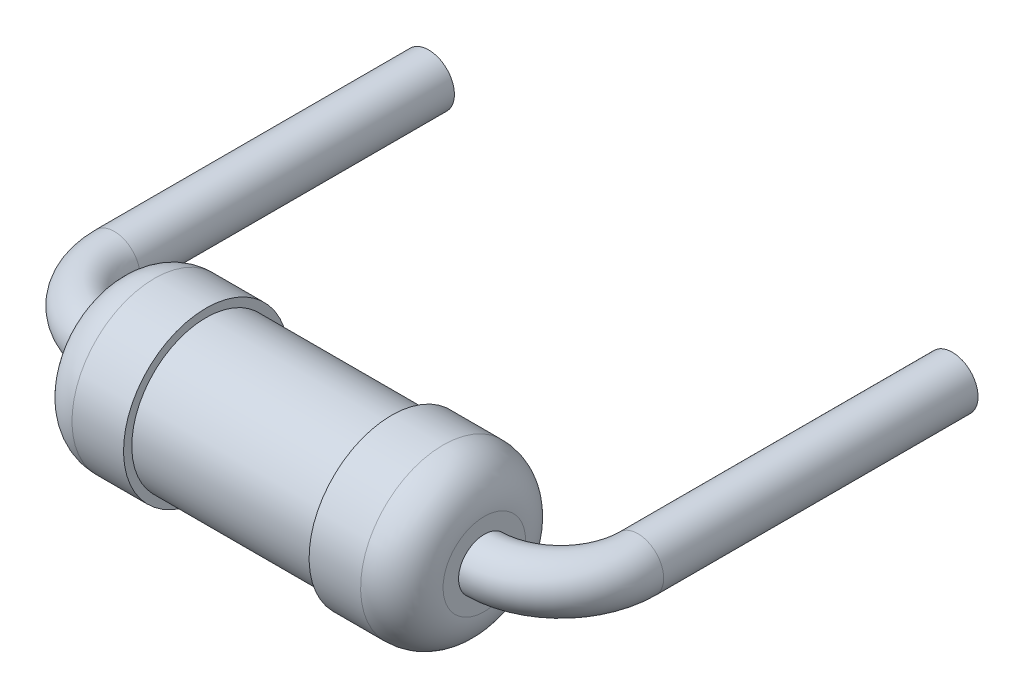
ISO-10303-21;
HEADER;
FILE_DESCRIPTION(('STEP AP214'),'2;1');
FILE_NAME('part.step','',(''),(''),'','','');
FILE_SCHEMA(('AUTOMOTIVE_DESIGN { 1 0 10303 214 1 1 1 1 }'));
ENDSEC;
DATA;
#1=APPLICATION_CONTEXT('core data for automotive mechanical design processes');
#2=APPLICATION_PROTOCOL_DEFINITION('international standard','automotive_design',2000,#1);
#3=PRODUCT_CONTEXT('',#1,'mechanical');
#4=PRODUCT('Part','Part','',(#3));
#5=PRODUCT_RELATED_PRODUCT_CATEGORY('part','',(#4));
#6=PRODUCT_DEFINITION_FORMATION('','',#4);
#7=PRODUCT_DEFINITION_CONTEXT('part definition',#1,'design');
#8=PRODUCT_DEFINITION('design','',#6,#7);
#9=PRODUCT_DEFINITION_SHAPE('','',#8);
#10=(LENGTH_UNIT() NAMED_UNIT(*) SI_UNIT(.MILLI.,.METRE.));
#11=(NAMED_UNIT(*) PLANE_ANGLE_UNIT() SI_UNIT($,.RADIAN.));
#12=(NAMED_UNIT(*) SI_UNIT($,.STERADIAN.) SOLID_ANGLE_UNIT());
#13=UNCERTAINTY_MEASURE_WITH_UNIT(LENGTH_MEASURE(1.E-05),#10,'distance_accuracy_value','');
#14=(GEOMETRIC_REPRESENTATION_CONTEXT(3) GLOBAL_UNCERTAINTY_ASSIGNED_CONTEXT((#13)) GLOBAL_UNIT_ASSIGNED_CONTEXT((#10,
#11,#12)) REPRESENTATION_CONTEXT('',''));
#15=CARTESIAN_POINT('',(0.,0.,0.));
#16=DIRECTION('',(0.,0.,1.));
#17=DIRECTION('',(1.,0.,0.));
#18=AXIS2_PLACEMENT_3D('',#15,#16,#17);
#19=CARTESIAN_POINT('',(4.83,0.,-3.));
#20=DIRECTION('',(0.,0.,1.));
#21=DIRECTION('',(1.,0.,0.));
#22=AXIS2_PLACEMENT_3D('',#19,#20,#21);
#23=PLANE('',#22);
#24=CARTESIAN_POINT('',(5.08,0.,-3.));
#25=DIRECTION('',(0.,0.,-1.));
#26=DIRECTION('',(-1.,0.,0.));
#27=AXIS2_PLACEMENT_3D('',#24,#25,#26);
#28=CIRCLE('',#27,0.25);
#29=CARTESIAN_POINT('',(4.83,0.,-3.));
#30=VERTEX_POINT('',#29);
#31=EDGE_CURVE('E11',#30,#30,#28,.T.);
#32=ORIENTED_EDGE('',*,*,#31,.T.);
#33=EDGE_LOOP('',(#32));
#34=FACE_BOUND('',#33,.T.);
#35=ADVANCED_FACE('F17',(#34),#23,.F.);
#36=CARTESIAN_POINT('',(5.08,0.,0.05));
#37=DIRECTION('',(0.,0.,-1.));
#38=DIRECTION('',(-1.,0.,0.));
#39=AXIS2_PLACEMENT_3D('',#36,#37,#38);
#40=CYLINDRICAL_SURFACE('',#39,0.25);
#41=DIRECTION('',(0.,0.,-1.));
#42=VECTOR('',#41,1.);
#43=CARTESIAN_POINT('',(4.83,0.,0.05));
#44=LINE('',#43,#42);
#45=CARTESIAN_POINT('',(4.83,0.,0.05));
#46=VERTEX_POINT('',#45);
#47=EDGE_CURVE('E25',#46,#30,#44,.T.);
#48=ORIENTED_EDGE('',*,*,#47,.T.);
#49=ORIENTED_EDGE('',*,*,#31,.F.);
#50=ORIENTED_EDGE('',*,*,#47,.F.);
#51=CARTESIAN_POINT('',(5.08,0.,0.05));
#52=DIRECTION('',(0.,0.,1.));
#53=DIRECTION('',(1.,0.,0.));
#54=AXIS2_PLACEMENT_3D('',#51,#52,#53);
#55=CIRCLE('',#54,0.25);
#56=EDGE_CURVE('E144',#46,#46,#55,.T.);
#57=ORIENTED_EDGE('',*,*,#56,.F.);
#58=EDGE_LOOP('',(#48,#49,#50,#57));
#59=FACE_BOUND('',#58,.T.);
#60=ADVANCED_FACE('F148',(#59),#40,.T.);
#61=CARTESIAN_POINT('',(4.33,0.,0.05));
#62=DIRECTION('',(0.,1.,0.));
#63=DIRECTION('',(0.,0.,1.));
#64=AXIS2_PLACEMENT_3D('',#61,#62,#63);
#65=TOROIDAL_SURFACE('',#64,0.75,0.25);
#66=CARTESIAN_POINT('',(4.34,0.,0.549899989998));
#67=CARTESIAN_POINT('',(4.34,-0.01164050410422,0.549899991162));
#68=CARTESIAN_POINT('',(4.34,-0.02328113700996,0.550622828944));
#69=CARTESIAN_POINT('',(4.34,-0.03485062492983,0.552068403169));
#70=CARTESIAN_POINT('',(4.34,-0.05786889927372,0.55640538608));
#71=CARTESIAN_POINT('',(4.34,-0.06931396793922,0.559316679184));
#72=CARTESIAN_POINT('',(4.34,-0.08054453861146,0.562940371124));
#73=CARTESIAN_POINT('',(4.34,-0.102472370435,0.571565542428));
#74=CARTESIAN_POINT('',(4.34,-0.113168471237,0.576570161904));
#75=CARTESIAN_POINT('',(4.34,-0.123520149554,0.582233698909));
#76=CARTESIAN_POINT('',(4.34,-0.143440927187,0.594813804343));
#77=CARTESIAN_POINT('',(4.34,-0.153008498876,0.601732848602));
#78=CARTESIAN_POINT('',(4.34,-0.162116805716,0.609236193325));
#79=CARTESIAN_POINT('',(4.34,-0.179326995951,0.625325812165));
#80=CARTESIAN_POINT('',(4.34,-0.187427805149,0.633913311284));
#81=CARTESIAN_POINT('',(4.34,-0.194970751604,0.642991732749));
#82=CARTESIAN_POINT('',(4.34,-0.208861923811,0.662021732419));
#83=CARTESIAN_POINT('',(4.34,-0.215210007466,0.671973515983));
#84=CARTESIAN_POINT('',(4.34,-0.220919853528,0.682306073073));
#85=CARTESIAN_POINT('',(4.34,-0.231000081052,0.703602963674));
#86=CARTESIAN_POINT('',(4.34,-0.235371260959,0.714567031657));
#87=CARTESIAN_POINT('',(4.34,-0.239044818889,0.725787734512));
#88=CARTESIAN_POINT('',(4.34,-0.244956633252,0.748597257437));
#89=CARTESIAN_POINT('',(4.34,-0.247196328539,0.760185820404));
#90=CARTESIAN_POINT('',(4.34,-0.248702721603,0.771896818599));
#91=CARTESIAN_POINT('',(4.34,-0.250236253198,0.795410784363));
#92=CARTESIAN_POINT('',(4.34,-0.250265081604,0.807213760322));
#93=CARTESIAN_POINT('',(4.34,-0.249550564145,0.818999739241));
#94=CARTESIAN_POINT('',(4.34,-0.246651196549,0.842384879388));
#95=CARTESIAN_POINT('',(4.34,-0.244467961817,0.853984364368));
#96=CARTESIAN_POINT('',(4.34,-0.241557769401,0.865427456673));
#97=CARTESIAN_POINT('',(4.34,-0.234328097063,0.887855103735));
#98=CARTESIAN_POINT('',(4.34,-0.230009957691,0.89884022225));
#99=CARTESIAN_POINT('',(4.34,-0.225007281178,0.909534878553));
#100=CARTESIAN_POINT('',(4.34,-0.213703414457,0.930210386901));
#101=CARTESIAN_POINT('',(4.34,-0.207403209753,0.940191922291));
#102=CARTESIAN_POINT('',(4.34,-0.200485423872,0.9497592585));
#103=CARTESIAN_POINT('',(4.34,-0.185507848737,0.9679501517));
#104=CARTESIAN_POINT('',(4.34,-0.177448695368,0.976574397374));
#105=CARTESIAN_POINT('',(4.34,-0.168861006149,0.984675563246));
#106=CARTESIAN_POINT('',(4.34,-0.150740352219,0.999737449451));
#107=CARTESIAN_POINT('',(4.34,-0.141207726994,1.006698777772));
#108=CARTESIAN_POINT('',(4.34,-0.131254458413,1.013046907821));
#109=CARTESIAN_POINT('',(4.34,-0.110632681236,1.024446271493));
#110=CARTESIAN_POINT('',(4.34,-0.09996428813031,1.029497977347));
#111=CARTESIAN_POINT('',(4.34,-0.08899810082804,1.033868315528));
#112=CARTESIAN_POINT('',(4.34,-0.06660573678443,1.041201389552));
#113=CARTESIAN_POINT('',(4.34,-0.05517952646699,1.044164431426));
#114=CARTESIAN_POINT('',(4.34,-0.04358893599727,1.046402273007));
#115=CARTESIAN_POINT('',(4.34,-0.02110235314309,1.049295690116));
#116=CARTESIAN_POINT('',(4.34,-0.01022004210752,1.050058171083));
#117=CARTESIAN_POINT('',(4.34,0.0006882613375073,1.050186160755));
#118=CARTESIAN_POINT('',(4.34,0.0233358865772,1.049137109091));
#119=CARTESIAN_POINT('',(4.34,0.03507031068188,1.04785246394));
#120=CARTESIAN_POINT('',(4.34,0.04670026038733,1.04583159902));
#121=CARTESIAN_POINT('',(4.34,0.06961621024999,1.040350011269));
#122=CARTESIAN_POINT('',(4.34,0.08090228630662,1.036889059544));
#123=CARTESIAN_POINT('',(4.34,0.09194735345427,1.032724648859));
#124=CARTESIAN_POINT('',(4.34,0.113430350588,1.023045880168));
#125=CARTESIAN_POINT('',(4.34,0.123868238698,1.017531119357));
#126=CARTESIAN_POINT('',(4.34,0.133937127535,1.011370767302));
#127=CARTESIAN_POINT('',(4.34,0.153226135103,0.99783763726));
#128=CARTESIAN_POINT('',(4.34,0.162446020713,0.990464305002));
#129=CARTESIAN_POINT('',(4.34,0.171182023116,0.982526335115));
#130=CARTESIAN_POINT('',(4.34,0.187593706196,0.965618198848));
#131=CARTESIAN_POINT('',(4.34,0.195268887616,0.956647370097));
#132=CARTESIAN_POINT('',(4.34,0.202362534275,0.947213093808));
#133=CARTESIAN_POINT('',(4.34,0.215315466445,0.927528883997));
#134=CARTESIAN_POINT('',(4.34,0.221173922232,0.917278252218));
#135=CARTESIAN_POINT('',(4.34,0.226373965152,0.906681994138));
#136=CARTESIAN_POINT('',(4.34,0.235409237469,0.884919036811));
#137=CARTESIAN_POINT('',(4.34,0.239243276281,0.873751706758));
#138=CARTESIAN_POINT('',(4.34,0.24236560706,0.862368932693));
#139=CARTESIAN_POINT('',(4.34,0.247163118276,0.839298280692));
#140=CARTESIAN_POINT('',(4.34,0.248836785479,0.827609961549));
#141=CARTESIAN_POINT('',(4.34,0.249770959641,0.815843924561));
#142=CARTESIAN_POINT('',(4.34,0.250160814947,0.792283062999));
#143=CARTESIAN_POINT('',(4.34,0.24961480538,0.780488090075));
#144=CARTESIAN_POINT('',(4.34,0.248327919554,0.768755472219));
#145=CARTESIAN_POINT('',(4.34,0.24429651896,0.745539328242));
#146=CARTESIAN_POINT('',(4.34,0.241550410048,0.734055962058));
#147=CARTESIAN_POINT('',(4.34,0.23808817101,0.722772047459));
#148=CARTESIAN_POINT('',(4.34,0.22977871686,0.700723294126));
#149=CARTESIAN_POINT('',(4.34,0.224930379057,0.689958764222));
#150=CARTESIAN_POINT('',(4.34,0.219415324052,0.679522729019));
#151=CARTESIAN_POINT('',(4.34,0.207122627566,0.659422435318));
#152=CARTESIAN_POINT('',(4.34,0.20034469825,0.649758245053));
#153=CARTESIAN_POINT('',(4.34,0.192971688189,0.640539169756));
#154=CARTESIAN_POINT('',(4.34,0.177131356967,0.623098938552));
#155=CARTESIAN_POINT('',(4.34,0.168664735605,0.614877058112));
#156=CARTESIAN_POINT('',(4.34,0.159694040411,0.607201210429));
#157=CARTESIAN_POINT('',(4.34,0.140866486823,0.593038035215));
#158=CARTESIAN_POINT('',(4.34,0.131011048519,0.586548760303));
#159=CARTESIAN_POINT('',(4.34,0.120759510971,0.580688498879));
#160=CARTESIAN_POINT('',(4.34,0.09960983218682,0.570303493605));
#161=CARTESIAN_POINT('',(4.34,0.08871311353879,0.56577575842));
#162=CARTESIAN_POINT('',(4.34,0.07754383250254,0.561940054475));
#163=CARTESIAN_POINT('',(4.34,0.05004266470253,0.554390331681));
#164=CARTESIAN_POINT('',(4.34,0.03350366980571,0.551397062442));
#165=CARTESIAN_POINT('',(4.34,0.01675151013628,0.549899991673));
#166=CARTESIAN_POINT('',(4.34,0.,0.549899989998));
#167=(BOUNDED_CURVE() B_SPLINE_CURVE(4,(#66,#67,#68,#69,#70,#71,#72,#73,#74,#75,#76,#77,#78,#79,
#80,#81,#82,#83,#84,#85,#86,#87,#88,#89,#90,#91,#92,#93,#94,#95,#96,#97,#98,#99,#100,#101,#102,
#103,#104,#105,#106,#107,#108,#109,#110,#111,#112,#113,#114,#115,#116,#117,#118,#119,#120,#121,
#122,#123,#124,#125,#126,#127,#128,#129,#130,#131,#132,#133,#134,#135,#136,#137,#138,#139,#140,
#141,#142,#143,#144,#145,#146,#147,#148,#149,#150,#151,#152,#153,#154,#155,#156,#157,#158,#159,
#160,#161,#162,#163,#164,#165,#166),.UNSPECIFIED.,.T.,.F.) B_SPLINE_CURVE_WITH_KNOTS((5,3,3,3,3,
3,3,3,3,3,3,3,3,3,3,3,3,3,3,3,3,3,3,3,3,3,3,3,3,3,3,3,3,5),(0.,0.02954854255526,
0.05950725143982,0.08953239653051,0.119615784102,0.149732114388,0.1798534838,0.209958258036,
0.240033799607,0.270075422819,0.300083939966,0.330063238238,0.360018474891,0.389954967342,
0.4198776386,0.449790835667,0.479698369962,0.507343389522,0.537249550404,0.567159850886,
0.597077915475,0.62700784525,0.656954319928,0.686922528179,0.716917796113,0.746944740378,
0.777005773224,0.807098913279,0.837215225316,0.867336923249,0.897438131975,0.927490895148,
0.957477675614,1.),
.UNSPECIFIED.) CURVE() GEOMETRIC_REPRESENTATION_ITEM() RATIONAL_B_SPLINE_CURVE((1.,1.,1.,1.,1.,
1.,1.,1.,1.,1.,1.,1.,1.,1.,1.,1.,1.,1.,1.,1.,1.,1.,1.,1.,1.,1.,1.,1.,1.,1.,1.,1.,1.,1.,1.,1.,1.,
1.,1.,1.,1.,1.,1.,1.,1.,1.,1.,1.,1.,1.,1.,1.,1.,1.,1.,1.,1.,1.,1.,1.,1.,1.,1.,1.,1.,1.,1.,1.,1.,
1.,1.,1.,1.,1.,1.,1.,1.,1.,1.,1.,1.,1.,1.,1.,1.,1.,1.,1.,1.,1.,1.,1.,1.,1.,1.,1.,1.,1.,1.,1.,1.)) REPRESENTATION_ITEM(''));
#168=CARTESIAN_POINT('',(4.34,0.,0.549899989998));
#169=VERTEX_POINT('',#168);
#170=EDGE_CURVE('E130',#169,#169,#167,.T.);
#171=ORIENTED_EDGE('',*,*,#170,.F.);
#172=CARTESIAN_POINT('',(4.33,0.,0.05));
#173=DIRECTION('',(0.,1.,0.));
#174=DIRECTION('',(0.,0.,1.));
#175=AXIS2_PLACEMENT_3D('',#172,#173,#174);
#176=CIRCLE('',#175,0.5);
#177=EDGE_CURVE('E136',#169,#46,#176,.T.);
#178=ORIENTED_EDGE('',*,*,#177,.T.);
#179=ORIENTED_EDGE('',*,*,#56,.T.);
#180=ORIENTED_EDGE('',*,*,#177,.F.);
#181=EDGE_LOOP('',(#171,#178,#179,#180));
#182=FACE_BOUND('',#181,.T.);
#183=ADVANCED_FACE('F151',(#182),#65,.T.);
#184=CARTESIAN_POINT('',(4.34,0.8,0.8));
#185=DIRECTION('',(-1.,0.,0.));
#186=DIRECTION('',(0.,0.,1.));
#187=AXIS2_PLACEMENT_3D('',#184,#185,#186);
#188=PLANE('',#187);
#189=ORIENTED_EDGE('',*,*,#170,.T.);
#190=EDGE_LOOP('',(#189));
#191=FACE_BOUND('',#190,.T.);
#192=CARTESIAN_POINT('',(4.34,0.,0.8));
#193=DIRECTION('',(1.,0.,0.));
#194=DIRECTION('',(0.,1.,0.));
#195=AXIS2_PLACEMENT_3D('',#192,#193,#194);
#196=CIRCLE('',#195,0.4);
#197=CARTESIAN_POINT('',(4.34,0.4,0.8));
#198=VERTEX_POINT('',#197);
#199=EDGE_CURVE('E137',#198,#198,#196,.T.);
#200=ORIENTED_EDGE('',*,*,#199,.T.);
#201=EDGE_LOOP('',(#200));
#202=FACE_BOUND('',#201,.T.);
#203=ADVANCED_FACE('F153',(#191,#202),#188,.F.);
#204=CARTESIAN_POINT('',(3.94,0.,0.8));
#205=DIRECTION('',(1.,0.,0.));
#206=DIRECTION('',(0.,1.,0.));
#207=AXIS2_PLACEMENT_3D('',#204,#205,#206);
#208=DEGENERATE_TOROIDAL_SURFACE('',#207,0.4,0.4,.T.);
#209=CARTESIAN_POINT('',(3.94,0.4,0.8));
#210=DIRECTION('',(0.,0.,-1.));
#211=DIRECTION('',(0.,1.,0.));
#212=AXIS2_PLACEMENT_3D('',#209,#210,#211);
#213=CIRCLE('',#212,0.4);
#214=CARTESIAN_POINT('',(3.94,0.8,0.8));
#215=VERTEX_POINT('',#214);
#216=EDGE_CURVE('E128',#215,#198,#213,.T.);
#217=ORIENTED_EDGE('',*,*,#216,.F.);
#218=CARTESIAN_POINT('',(3.94,0.,0.8));
#219=DIRECTION('',(1.,0.,0.));
#220=DIRECTION('',(0.,1.,0.));
#221=AXIS2_PLACEMENT_3D('',#218,#219,#220);
#222=CIRCLE('',#221,0.8);
#223=EDGE_CURVE('E124',#215,#215,#222,.T.);
#224=ORIENTED_EDGE('',*,*,#223,.T.);
#225=ORIENTED_EDGE('',*,*,#216,.T.);
#226=ORIENTED_EDGE('',*,*,#199,.F.);
#227=EDGE_LOOP('',(#217,#224,#225,#226));
#228=FACE_BOUND('',#227,.T.);
#229=ADVANCED_FACE('F156',(#228),#208,.T.);
#230=CARTESIAN_POINT('',(0.25,0.,-3.));
#231=DIRECTION('',(0.,0.,-1.));
#232=DIRECTION('',(0.,-1.,0.));
#233=AXIS2_PLACEMENT_3D('',#230,#231,#232);
#234=PLANE('',#233);
#235=CARTESIAN_POINT('',(0.,0.,-3.));
#236=DIRECTION('',(0.,0.,1.));
#237=DIRECTION('',(1.,0.,0.));
#238=AXIS2_PLACEMENT_3D('',#235,#236,#237);
#239=CIRCLE('',#238,0.25);
#240=CARTESIAN_POINT('',(0.25,0.,-3.));
#241=VERTEX_POINT('',#240);
#242=EDGE_CURVE('E99',#241,#241,#239,.T.);
#243=ORIENTED_EDGE('',*,*,#242,.F.);
#244=EDGE_LOOP('',(#243));
#245=FACE_BOUND('',#244,.T.);
#246=ADVANCED_FACE('F238',(#245),#234,.T.);
#247=CARTESIAN_POINT('',(3.44,0.,0.8));
#248=DIRECTION('',(-1.,0.,0.));
#249=DIRECTION('',(0.,1.,0.));
#250=AXIS2_PLACEMENT_3D('',#247,#248,#249);
#251=CYLINDRICAL_SURFACE('',#250,0.8);
#252=CARTESIAN_POINT('',(3.44,0.,0.8));
#253=DIRECTION('',(1.,0.,0.));
#254=DIRECTION('',(0.,1.,0.));
#255=AXIS2_PLACEMENT_3D('',#252,#253,#254);
#256=CIRCLE('',#255,0.8);
#257=CARTESIAN_POINT('',(3.44,0.8,0.8));
#258=VERTEX_POINT('',#257);
#259=EDGE_CURVE('E101',#258,#258,#256,.T.);
#260=ORIENTED_EDGE('',*,*,#259,.T.);
#261=DIRECTION('',(1.,0.,0.));
#262=VECTOR('',#261,1.);
#263=CARTESIAN_POINT('',(3.44,0.8,0.8));
#264=LINE('',#263,#262);
#265=EDGE_CURVE('E129',#258,#215,#264,.T.);
#266=ORIENTED_EDGE('',*,*,#265,.T.);
#267=ORIENTED_EDGE('',*,*,#223,.F.);
#268=ORIENTED_EDGE('',*,*,#265,.F.);
#269=EDGE_LOOP('',(#260,#266,#267,#268));
#270=FACE_BOUND('',#269,.T.);
#271=ADVANCED_FACE('F242',(#270),#251,.T.);
#272=CARTESIAN_POINT('',(0.,0.,-3.));
#273=DIRECTION('',(0.,0.,1.));
#274=DIRECTION('',(1.,0.,0.));
#275=AXIS2_PLACEMENT_3D('',#272,#273,#274);
#276=CYLINDRICAL_SURFACE('',#275,0.25);
#277=DIRECTION('',(0.,0.,1.));
#278=VECTOR('',#277,1.);
#279=CARTESIAN_POINT('',(0.25,0.,-3.));
#280=LINE('',#279,#278);
#281=CARTESIAN_POINT('',(0.25,0.,0.05));
#282=VERTEX_POINT('',#281);
#283=EDGE_CURVE('E93',#241,#282,#280,.T.);
#284=ORIENTED_EDGE('',*,*,#283,.T.);
#285=CARTESIAN_POINT('',(0.,0.,0.05));
#286=DIRECTION('',(0.,0.,1.));
#287=DIRECTION('',(1.,0.,0.));
#288=AXIS2_PLACEMENT_3D('',#285,#286,#287);
#289=CIRCLE('',#288,0.25);
#290=EDGE_CURVE('E97',#282,#282,#289,.T.);
#291=ORIENTED_EDGE('',*,*,#290,.F.);
#292=ORIENTED_EDGE('',*,*,#283,.F.);
#293=ORIENTED_EDGE('',*,*,#242,.T.);
#294=EDGE_LOOP('',(#284,#291,#292,#293));
#295=FACE_BOUND('',#294,.T.);
#296=ADVANCED_FACE('F95',(#295),#276,.T.);
#297=CARTESIAN_POINT('',(3.44,0.8,0.8));
#298=DIRECTION('',(-1.,0.,0.));
#299=DIRECTION('',(0.,0.,1.));
#300=AXIS2_PLACEMENT_3D('',#297,#298,#299);
#301=PLANE('',#300);
#302=CARTESIAN_POINT('',(3.44,0.,0.8));
#303=DIRECTION('',(-1.,0.,0.));
#304=DIRECTION('',(0.,1.,0.));
#305=AXIS2_PLACEMENT_3D('',#302,#303,#304);
#306=CIRCLE('',#305,0.72);
#307=CARTESIAN_POINT('',(3.44,0.72,0.8));
#308=VERTEX_POINT('',#307);
#309=EDGE_CURVE('E182',#308,#308,#306,.T.);
#310=ORIENTED_EDGE('',*,*,#309,.F.);
#311=EDGE_LOOP('',(#310));
#312=FACE_BOUND('',#311,.T.);
#313=ORIENTED_EDGE('',*,*,#259,.F.);
#314=EDGE_LOOP('',(#313));
#315=FACE_BOUND('',#314,.T.);
#316=ADVANCED_FACE('F241',(#312,#315),#301,.T.);
#317=CARTESIAN_POINT('',(0.75,0.,0.05));
#318=DIRECTION('',(0.,1.,0.));
#319=DIRECTION('',(-1.,0.,0.));
#320=AXIS2_PLACEMENT_3D('',#317,#318,#319);
#321=TOROIDAL_SURFACE('',#320,0.75,0.25);
#322=ORIENTED_EDGE('',*,*,#290,.T.);
#323=CARTESIAN_POINT('',(0.75,0.,0.05));
#324=DIRECTION('',(0.,1.,0.));
#325=DIRECTION('',(-1.,0.,0.));
#326=AXIS2_PLACEMENT_3D('',#323,#324,#325);
#327=CIRCLE('',#326,0.5);
#328=CARTESIAN_POINT('',(0.74,0.,0.549899989998));
#329=VERTEX_POINT('',#328);
#330=EDGE_CURVE('E105',#282,#329,#327,.T.);
#331=ORIENTED_EDGE('',*,*,#330,.T.);
#332=CARTESIAN_POINT('',(0.74,0.,0.549899989998));
#333=CARTESIAN_POINT('',(0.74,-0.01164050410382,0.549899991162));
#334=CARTESIAN_POINT('',(0.74,-0.02328113700915,0.550622828944));
#335=CARTESIAN_POINT('',(0.74,-0.03485062492862,0.552068403168));
#336=CARTESIAN_POINT('',(0.74,-0.05786889927215,0.556405386079));
#337=CARTESIAN_POINT('',(0.74,-0.06931396793767,0.559316679183));
#338=CARTESIAN_POINT('',(0.74,-0.08054453860993,0.562940371123));
#339=CARTESIAN_POINT('',(0.74,-0.102472370433,0.571565542427));
#340=CARTESIAN_POINT('',(0.74,-0.113168471235,0.576570161904));
#341=CARTESIAN_POINT('',(0.74,-0.123520149553,0.582233698908));
#342=CARTESIAN_POINT('',(0.74,-0.143440927185,0.594813804342));
#343=CARTESIAN_POINT('',(0.74,-0.153008498875,0.601732848601));
#344=CARTESIAN_POINT('',(0.74,-0.162116805714,0.609236193324));
#345=CARTESIAN_POINT('',(0.74,-0.17932699595,0.625325812164));
#346=CARTESIAN_POINT('',(0.74,-0.187427805148,0.633913311283));
#347=CARTESIAN_POINT('',(0.74,-0.194970751603,0.642991732747));
#348=CARTESIAN_POINT('',(0.74,-0.20886192381,0.662021732418));
#349=CARTESIAN_POINT('',(0.74,-0.215210007465,0.671973515981));
#350=CARTESIAN_POINT('',(0.74,-0.220919853528,0.682306073072));
#351=CARTESIAN_POINT('',(0.74,-0.231000081052,0.703602963673));
#352=CARTESIAN_POINT('',(0.74,-0.235371260958,0.714567031655));
#353=CARTESIAN_POINT('',(0.74,-0.239044818888,0.725787734511));
#354=CARTESIAN_POINT('',(0.74,-0.244956633251,0.748597257435));
#355=CARTESIAN_POINT('',(0.74,-0.247196328538,0.760185820402));
#356=CARTESIAN_POINT('',(0.74,-0.248702721603,0.771896818597));
#357=CARTESIAN_POINT('',(0.74,-0.250236253198,0.795410784361));
#358=CARTESIAN_POINT('',(0.74,-0.250265081605,0.80721376032));
#359=CARTESIAN_POINT('',(0.74,-0.249550564145,0.818999739239));
#360=CARTESIAN_POINT('',(0.74,-0.246651196549,0.842384879386));
#361=CARTESIAN_POINT('',(0.74,-0.244467961818,0.853984364366));
#362=CARTESIAN_POINT('',(0.74,-0.241557769402,0.865427456671));
#363=CARTESIAN_POINT('',(0.74,-0.234328097064,0.887855103733));
#364=CARTESIAN_POINT('',(0.74,-0.230009957692,0.898840222248));
#365=CARTESIAN_POINT('',(0.74,-0.225007281179,0.909534878551));
#366=CARTESIAN_POINT('',(0.74,-0.213703414458,0.930210386899));
#367=CARTESIAN_POINT('',(0.74,-0.207403209754,0.94019192229));
#368=CARTESIAN_POINT('',(0.74,-0.200485423873,0.949759258498));
#369=CARTESIAN_POINT('',(0.74,-0.185507848738,0.967950151698));
#370=CARTESIAN_POINT('',(0.74,-0.177448695369,0.976574397373));
#371=CARTESIAN_POINT('',(0.74,-0.16886100615,0.984675563245));
#372=CARTESIAN_POINT('',(0.74,-0.15074035222,0.99973744945));
#373=CARTESIAN_POINT('',(0.74,-0.141207726995,1.006698777771));
#374=CARTESIAN_POINT('',(0.74,-0.131254458415,1.01304690782));
#375=CARTESIAN_POINT('',(0.74,-0.110632681238,1.024446271492));
#376=CARTESIAN_POINT('',(0.74,-0.09996428813179,1.029497977347));
#377=CARTESIAN_POINT('',(0.74,-0.08899810082955,1.033868315527));
#378=CARTESIAN_POINT('',(0.74,-0.06660573678598,1.041201389552));
#379=CARTESIAN_POINT('',(0.74,-0.05517952646857,1.044164431425));
#380=CARTESIAN_POINT('',(0.74,-0.04358893599885,1.046402273007));
#381=CARTESIAN_POINT('',(0.74,-0.02110235317185,1.049295690112));
#382=CARTESIAN_POINT('',(0.74,-0.01022004216384,1.050058171079));
#383=CARTESIAN_POINT('',(0.74,0.000688261253639,1.050186160754));
#384=CARTESIAN_POINT('',(0.74,0.02333588646645,1.049137109102));
#385=CARTESIAN_POINT('',(0.74,0.03507031057171,1.047852463956));
#386=CARTESIAN_POINT('',(0.74,0.04670026027805,1.045831599041));
#387=CARTESIAN_POINT('',(0.74,0.06961621014314,1.0403500113));
#388=CARTESIAN_POINT('',(0.74,0.08090228620131,1.03688905958));
#389=CARTESIAN_POINT('',(0.74,0.09194735335081,1.032724648899));
#390=CARTESIAN_POINT('',(0.74,0.113430350488,1.023045880218));
#391=CARTESIAN_POINT('',(0.74,0.123868238602,1.017531119412));
#392=CARTESIAN_POINT('',(0.74,0.133937127441,1.011370767362));
#393=CARTESIAN_POINT('',(0.74,0.153226135015,0.997837637328));
#394=CARTESIAN_POINT('',(0.74,0.162446020628,0.990464305074));
#395=CARTESIAN_POINT('',(0.74,0.171182023035,0.982526335191));
#396=CARTESIAN_POINT('',(0.74,0.187593706123,0.965618198931));
#397=CARTESIAN_POINT('',(0.74,0.195268887546,0.956647370184));
#398=CARTESIAN_POINT('',(0.74,0.202362534209,0.947213093898));
#399=CARTESIAN_POINT('',(0.74,0.215315466389,0.927528884092));
#400=CARTESIAN_POINT('',(0.74,0.221173922179,0.917278252316));
#401=CARTESIAN_POINT('',(0.74,0.226373965104,0.906681994238));
#402=CARTESIAN_POINT('',(0.74,0.235409237432,0.884919036916));
#403=CARTESIAN_POINT('',(0.74,0.239243276248,0.873751706864));
#404=CARTESIAN_POINT('',(0.74,0.242365607032,0.862368932801));
#405=CARTESIAN_POINT('',(0.74,0.247163118259,0.839298280802));
#406=CARTESIAN_POINT('',(0.74,0.248836785466,0.827609961659));
#407=CARTESIAN_POINT('',(0.74,0.249770959634,0.815843924672));
#408=CARTESIAN_POINT('',(0.74,0.250160814951,0.79228306311));
#409=CARTESIAN_POINT('',(0.74,0.249614805388,0.780488090186));
#410=CARTESIAN_POINT('',(0.74,0.248327919568,0.76875547233));
#411=CARTESIAN_POINT('',(0.74,0.244296518984,0.745539328351));
#412=CARTESIAN_POINT('',(0.74,0.241550410078,0.734055962165));
#413=CARTESIAN_POINT('',(0.74,0.238088171044,0.722772047565));
#414=CARTESIAN_POINT('',(0.74,0.229778716904,0.700723294228));
#415=CARTESIAN_POINT('',(0.74,0.224930379106,0.689958764322));
#416=CARTESIAN_POINT('',(0.74,0.219415324105,0.679522729116));
#417=CARTESIAN_POINT('',(0.74,0.207122627628,0.65942243541));
#418=CARTESIAN_POINT('',(0.74,0.200344698317,0.649758245142));
#419=CARTESIAN_POINT('',(0.74,0.19297168826,0.640539169842));
#420=CARTESIAN_POINT('',(0.74,0.177131357046,0.623098938631));
#421=CARTESIAN_POINT('',(0.74,0.168664735687,0.614877058187));
#422=CARTESIAN_POINT('',(0.74,0.159694040497,0.6072012105));
#423=CARTESIAN_POINT('',(0.74,0.140866486915,0.593038035278));
#424=CARTESIAN_POINT('',(0.74,0.131011048613,0.586548760361));
#425=CARTESIAN_POINT('',(0.74,0.120759511068,0.580688498933));
#426=CARTESIAN_POINT('',(0.74,0.09960983228886,0.570303493649));
#427=CARTESIAN_POINT('',(0.74,0.08871311364285,0.565775758459));
#428=CARTESIAN_POINT('',(0.74,0.07754383260831,0.561940054509));
#429=CARTESIAN_POINT('',(0.74,0.05004266478494,0.554390331695));
#430=CARTESIAN_POINT('',(0.74,0.03350366986136,0.551397062447));
#431=CARTESIAN_POINT('',(0.74,0.0167515101641,0.549899991673));
#432=CARTESIAN_POINT('',(0.74,0.,0.549899989998));
#433=(BOUNDED_CURVE() B_SPLINE_CURVE(4,(#332,#333,#334,#335,#336,#337,#338,#339,#340,#341,#342,
#343,#344,#345,#346,#347,#348,#349,#350,#351,#352,#353,#354,#355,#356,#357,#358,#359,#360,#361,
#362,#363,#364,#365,#366,#367,#368,#369,#370,#371,#372,#373,#374,#375,#376,#377,#378,#379,#380,
#381,#382,#383,#384,#385,#386,#387,#388,#389,#390,#391,#392,#393,#394,#395,#396,#397,#398,#399,
#400,#401,#402,#403,#404,#405,#406,#407,#408,#409,#410,#411,#412,#413,#414,#415,#416,#417,#418,
#419,#420,#421,#422,#423,#424,#425,#426,#427,#428,#429,#430,#431,#432),.UNSPECIFIED.,.T.,
.F.) B_SPLINE_CURVE_WITH_KNOTS((5,3,3,3,3,3,3,3,3,3,3,3,3,3,3,3,3,3,3,3,3,3,3,3,3,3,3,3,3,3,3,3,
3,5),(0.,0.02954854255424,0.05950725143879,0.08953239652948,0.1196157841,0.149732114387,
0.179853483798,0.209958258035,0.240033799606,0.270075422818,0.300083939965,0.330063238237,
0.36001847489,0.38995496734,0.419877638599,0.449790835666,0.479698369961,0.507343389451,
0.537249550333,0.567159850816,0.597077915405,0.627007845179,0.656954319857,0.686922528108,
0.716917796043,0.746944740308,0.777005773153,0.807098913208,0.837215225245,0.867336923178,
0.897438131904,0.927490895077,0.957477675543,1.),
.UNSPECIFIED.) CURVE() GEOMETRIC_REPRESENTATION_ITEM() RATIONAL_B_SPLINE_CURVE((1.,1.,1.,1.,1.,
1.,1.,1.,1.,1.,1.,1.,1.,1.,1.,1.,1.,1.,1.,1.,1.,1.,1.,1.,1.,1.,1.,1.,1.,1.,1.,1.,1.,1.,1.,1.,1.,
1.,1.,1.,1.,1.,1.,1.,1.,1.,1.,1.,1.,1.,1.,1.,1.,1.,1.,1.,1.,1.,1.,1.,1.,1.,1.,1.,1.,1.,1.,1.,1.,
1.,1.,1.,1.,1.,1.,1.,1.,1.,1.,1.,1.,1.,1.,1.,1.,1.,1.,1.,1.,1.,1.,1.,1.,1.,1.,1.,1.,1.,1.,1.,1.)) REPRESENTATION_ITEM(''));
#434=EDGE_CURVE('E108',#329,#329,#433,.T.);
#435=ORIENTED_EDGE('',*,*,#434,.T.);
#436=ORIENTED_EDGE('',*,*,#330,.F.);
#437=EDGE_LOOP('',(#322,#331,#435,#436));
#438=FACE_BOUND('',#437,.T.);
#439=ADVANCED_FACE('F106',(#438),#321,.T.);
#440=CARTESIAN_POINT('',(0.74,0.,0.8));
#441=DIRECTION('',(-1.,0.,0.));
#442=DIRECTION('',(0.,1.,0.));
#443=AXIS2_PLACEMENT_3D('',#440,#441,#442);
#444=CYLINDRICAL_SURFACE('',#443,0.72);
#445=ORIENTED_EDGE('',*,*,#309,.T.);
#446=DIRECTION('',(1.,0.,0.));
#447=VECTOR('',#446,1.);
#448=CARTESIAN_POINT('',(0.74,0.72,0.8));
#449=LINE('',#448,#447);
#450=CARTESIAN_POINT('',(1.64,0.72,0.8));
#451=VERTEX_POINT('',#450);
#452=EDGE_CURVE('E117',#451,#308,#449,.T.);
#453=ORIENTED_EDGE('',*,*,#452,.F.);
#454=CARTESIAN_POINT('',(1.64,0.,0.8));
#455=DIRECTION('',(-1.,0.,0.));
#456=DIRECTION('',(0.,1.,0.));
#457=AXIS2_PLACEMENT_3D('',#454,#455,#456);
#458=CIRCLE('',#457,0.72);
#459=EDGE_CURVE('E174',#451,#451,#458,.T.);
#460=ORIENTED_EDGE('',*,*,#459,.F.);
#461=ORIENTED_EDGE('',*,*,#452,.T.);
#462=EDGE_LOOP('',(#445,#453,#460,#461));
#463=FACE_BOUND('',#462,.T.);
#464=ADVANCED_FACE('F251',(#463),#444,.T.);
#465=CARTESIAN_POINT('',(0.74,0.8,0.8));
#466=DIRECTION('',(-1.,0.,0.));
#467=DIRECTION('',(0.,0.,1.));
#468=AXIS2_PLACEMENT_3D('',#465,#466,#467);
#469=PLANE('',#468);
#470=ORIENTED_EDGE('',*,*,#434,.F.);
#471=EDGE_LOOP('',(#470));
#472=FACE_BOUND('',#471,.T.);
#473=CARTESIAN_POINT('',(0.74,0.,0.8));
#474=DIRECTION('',(1.,0.,0.));
#475=DIRECTION('',(0.,1.,0.));
#476=AXIS2_PLACEMENT_3D('',#473,#474,#475);
#477=CIRCLE('',#476,0.4);
#478=CARTESIAN_POINT('',(0.74,0.4,0.8));
#479=VERTEX_POINT('',#478);
#480=EDGE_CURVE('E175',#479,#479,#477,.T.);
#481=ORIENTED_EDGE('',*,*,#480,.F.);
#482=EDGE_LOOP('',(#481));
#483=FACE_BOUND('',#482,.T.);
#484=ADVANCED_FACE('F225',(#472,#483),#469,.T.);
#485=CARTESIAN_POINT('',(1.64,0.8,0.8));
#486=DIRECTION('',(-1.,0.,0.));
#487=DIRECTION('',(0.,0.,1.));
#488=AXIS2_PLACEMENT_3D('',#485,#486,#487);
#489=PLANE('',#488);
#490=ORIENTED_EDGE('',*,*,#459,.T.);
#491=EDGE_LOOP('',(#490));
#492=FACE_BOUND('',#491,.T.);
#493=CARTESIAN_POINT('',(1.64,0.,0.8));
#494=DIRECTION('',(1.,0.,0.));
#495=DIRECTION('',(0.,1.,0.));
#496=AXIS2_PLACEMENT_3D('',#493,#494,#495);
#497=CIRCLE('',#496,0.8);
#498=CARTESIAN_POINT('',(1.64,0.8,0.8));
#499=VERTEX_POINT('',#498);
#500=EDGE_CURVE('E170',#499,#499,#497,.T.);
#501=ORIENTED_EDGE('',*,*,#500,.T.);
#502=EDGE_LOOP('',(#501));
#503=FACE_BOUND('',#502,.T.);
#504=ADVANCED_FACE('F211',(#492,#503),#489,.F.);
#505=CARTESIAN_POINT('',(1.14,0.,0.8));
#506=DIRECTION('',(-1.,0.,0.));
#507=DIRECTION('',(0.,1.,0.));
#508=AXIS2_PLACEMENT_3D('',#505,#506,#507);
#509=DEGENERATE_TOROIDAL_SURFACE('',#508,0.4,0.4,.T.);
#510=ORIENTED_EDGE('',*,*,#480,.T.);
#511=CARTESIAN_POINT('',(1.14,0.4,0.8));
#512=DIRECTION('',(0.,0.,1.));
#513=DIRECTION('',(0.,1.,0.));
#514=AXIS2_PLACEMENT_3D('',#511,#512,#513);
#515=CIRCLE('',#514,0.4);
#516=CARTESIAN_POINT('',(1.14,0.8,0.8));
#517=VERTEX_POINT('',#516);
#518=EDGE_CURVE('E172',#517,#479,#515,.T.);
#519=ORIENTED_EDGE('',*,*,#518,.F.);
#520=CARTESIAN_POINT('',(1.14,0.,0.8));
#521=DIRECTION('',(1.,0.,0.));
#522=DIRECTION('',(0.,1.,0.));
#523=AXIS2_PLACEMENT_3D('',#520,#521,#522);
#524=CIRCLE('',#523,0.8);
#525=EDGE_CURVE('E196',#517,#517,#524,.T.);
#526=ORIENTED_EDGE('',*,*,#525,.F.);
#527=ORIENTED_EDGE('',*,*,#518,.T.);
#528=EDGE_LOOP('',(#510,#519,#526,#527));
#529=FACE_BOUND('',#528,.T.);
#530=ADVANCED_FACE('F216',(#529),#509,.T.);
#531=CARTESIAN_POINT('',(0.74,0.,0.8));
#532=DIRECTION('',(-1.,0.,0.));
#533=DIRECTION('',(0.,1.,0.));
#534=AXIS2_PLACEMENT_3D('',#531,#532,#533);
#535=CYLINDRICAL_SURFACE('',#534,0.8);
#536=ORIENTED_EDGE('',*,*,#525,.T.);
#537=DIRECTION('',(1.,0.,0.));
#538=VECTOR('',#537,1.);
#539=CARTESIAN_POINT('',(0.74,0.8,0.8));
#540=LINE('',#539,#538);
#541=EDGE_CURVE('E192',#517,#499,#540,.T.);
#542=ORIENTED_EDGE('',*,*,#541,.T.);
#543=ORIENTED_EDGE('',*,*,#500,.F.);
#544=ORIENTED_EDGE('',*,*,#541,.F.);
#545=EDGE_LOOP('',(#536,#542,#543,#544));
#546=FACE_BOUND('',#545,.T.);
#547=ADVANCED_FACE('F214',(#546),#535,.T.);
#548=CLOSED_SHELL('',(#35,#60,#183,#203,#229,#246,#271,#296,#316,#439,#464,#484,#504,#530,#547));
#549=MANIFOLD_SOLID_BREP('B1',#548);
#550=ADVANCED_BREP_SHAPE_REPRESENTATION('',(#18,#549),#14);
#551=SHAPE_DEFINITION_REPRESENTATION(#9,#550);
ENDSEC;
END-ISO-10303-21;
